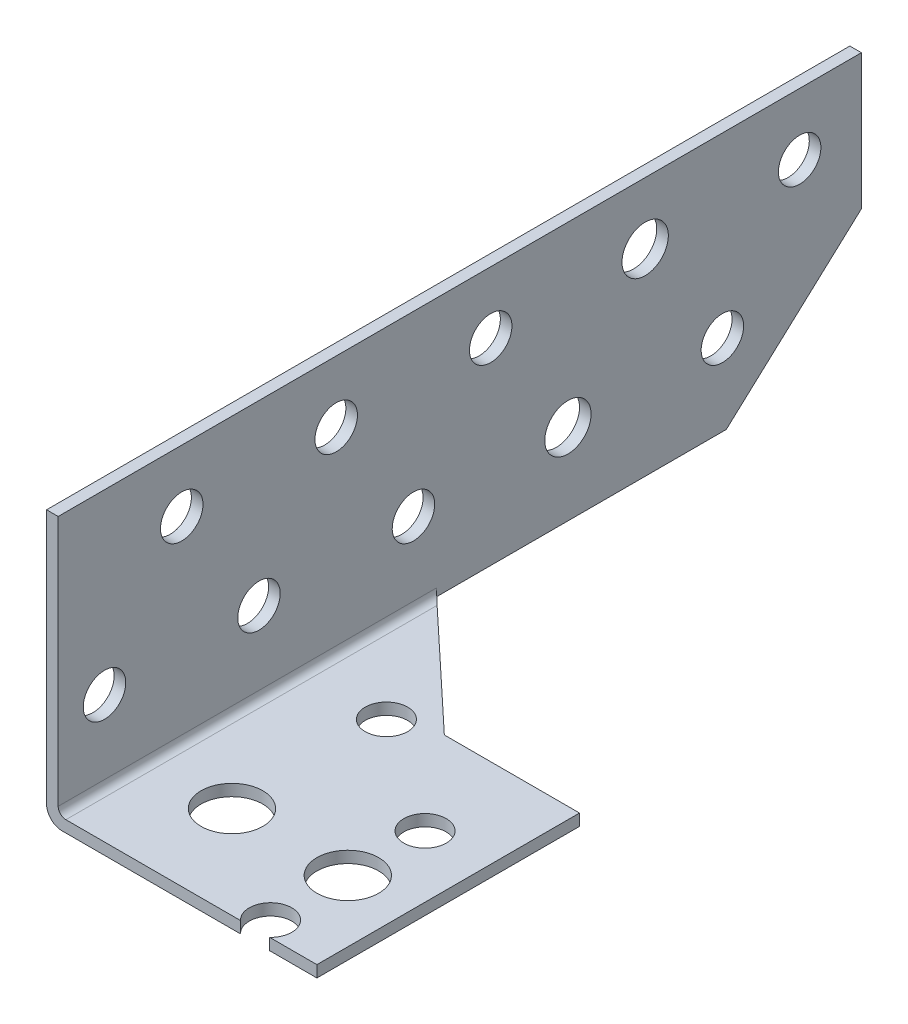
ISO-10303-21;
HEADER;
FILE_DESCRIPTION(('STEP AP214'),'2;1');
FILE_NAME('part.step','',(''),(''),'','','');
FILE_SCHEMA(('AUTOMOTIVE_DESIGN { 1 0 10303 214 1 1 1 1 }'));
ENDSEC;
DATA;
#1=APPLICATION_CONTEXT('core data for automotive mechanical design processes');
#2=APPLICATION_PROTOCOL_DEFINITION('international standard','automotive_design',2000,#1);
#3=PRODUCT_CONTEXT('',#1,'mechanical');
#4=PRODUCT('Part','Part','',(#3));
#5=PRODUCT_RELATED_PRODUCT_CATEGORY('part','',(#4));
#6=PRODUCT_DEFINITION_FORMATION('','',#4);
#7=PRODUCT_DEFINITION_CONTEXT('part definition',#1,'design');
#8=PRODUCT_DEFINITION('design','',#6,#7);
#9=PRODUCT_DEFINITION_SHAPE('','',#8);
#10=(LENGTH_UNIT() NAMED_UNIT(*) SI_UNIT(.MILLI.,.METRE.));
#11=(NAMED_UNIT(*) PLANE_ANGLE_UNIT() SI_UNIT($,.RADIAN.));
#12=(NAMED_UNIT(*) SI_UNIT($,.STERADIAN.) SOLID_ANGLE_UNIT());
#13=UNCERTAINTY_MEASURE_WITH_UNIT(LENGTH_MEASURE(1.E-05),#10,'distance_accuracy_value','');
#14=(GEOMETRIC_REPRESENTATION_CONTEXT(3) GLOBAL_UNCERTAINTY_ASSIGNED_CONTEXT((#13)) GLOBAL_UNIT_ASSIGNED_CONTEXT((#10,
#11,#12)) REPRESENTATION_CONTEXT('',''));
#15=CARTESIAN_POINT('',(0.,0.,0.));
#16=DIRECTION('',(0.,0.,1.));
#17=DIRECTION('',(1.,0.,0.));
#18=AXIS2_PLACEMENT_3D('',#15,#16,#17);
#19=CARTESIAN_POINT('',(-0.75,0.,210.));
#20=DIRECTION('',(1.,0.,0.));
#21=DIRECTION('',(0.,1.,0.));
#22=AXIS2_PLACEMENT_3D('',#19,#20,#21);
#23=PLANE('',#22);
#24=CARTESIAN_POINT('',(-0.750000000000001,9.5,28.));
#25=DIRECTION('',(1.,0.,0.));
#26=DIRECTION('',(0.,1.,0.));
#27=AXIS2_PLACEMENT_3D('',#24,#25,#26);
#28=CIRCLE('',#27,3.);
#29=CARTESIAN_POINT('',(-0.750000000000001,12.5,28.));
#30=VERTEX_POINT('',#29);
#31=EDGE_CURVE('E390',#30,#30,#28,.T.);
#32=ORIENTED_EDGE('',*,*,#31,.T.);
#33=EDGE_LOOP('',(#32));
#34=FACE_BOUND('',#33,.T.);
#35=CARTESIAN_POINT('',(-0.749999999999999,-5.5,38.));
#36=DIRECTION('',(1.,0.,0.));
#37=DIRECTION('',(0.,1.,0.));
#38=AXIS2_PLACEMENT_3D('',#35,#36,#37);
#39=CIRCLE('',#38,3.);
#40=CARTESIAN_POINT('',(-0.749999999999999,-2.5,38.));
#41=VERTEX_POINT('',#40);
#42=EDGE_CURVE('E394',#41,#41,#39,.T.);
#43=ORIENTED_EDGE('',*,*,#42,.T.);
#44=EDGE_LOOP('',(#43));
#45=FACE_BOUND('',#44,.T.);
#46=CARTESIAN_POINT('',(-0.749999999999999,-5.5,18.));
#47=DIRECTION('',(1.,0.,0.));
#48=DIRECTION('',(0.,1.,0.));
#49=AXIS2_PLACEMENT_3D('',#46,#47,#48);
#50=CIRCLE('',#49,2.75);
#51=CARTESIAN_POINT('',(-0.749999999999999,-2.75,18.));
#52=VERTEX_POINT('',#51);
#53=EDGE_CURVE('E296',#52,#52,#50,.T.);
#54=ORIENTED_EDGE('',*,*,#53,.T.);
#55=EDGE_LOOP('',(#54));
#56=FACE_BOUND('',#55,.T.);
#57=CARTESIAN_POINT('',(-0.750000000000001,9.49999999999999,88.));
#58=DIRECTION('',(1.,0.,0.));
#59=DIRECTION('',(0.,1.,0.));
#60=AXIS2_PLACEMENT_3D('',#57,#58,#59);
#61=CIRCLE('',#60,2.75000000000001);
#62=CARTESIAN_POINT('',(-0.750000000000002,12.25,88.));
#63=VERTEX_POINT('',#62);
#64=EDGE_CURVE('E292',#63,#63,#61,.T.);
#65=ORIENTED_EDGE('',*,*,#64,.T.);
#66=EDGE_LOOP('',(#65));
#67=FACE_BOUND('',#66,.T.);
#68=CARTESIAN_POINT('',(-0.750000000000001,9.49999999999999,68.));
#69=DIRECTION('',(1.,0.,0.));
#70=DIRECTION('',(0.,1.,0.));
#71=AXIS2_PLACEMENT_3D('',#68,#69,#70);
#72=CIRCLE('',#71,2.75000000000001);
#73=CARTESIAN_POINT('',(-0.750000000000002,12.25,68.));
#74=VERTEX_POINT('',#73);
#75=EDGE_CURVE('E288',#74,#74,#72,.T.);
#76=ORIENTED_EDGE('',*,*,#75,.T.);
#77=EDGE_LOOP('',(#76));
#78=FACE_BOUND('',#77,.T.);
#79=CARTESIAN_POINT('',(-0.750000000000001,9.5,48.));
#80=DIRECTION('',(1.,0.,0.));
#81=DIRECTION('',(0.,1.,0.));
#82=AXIS2_PLACEMENT_3D('',#79,#80,#81);
#83=CIRCLE('',#82,2.75);
#84=CARTESIAN_POINT('',(-0.750000000000002,12.25,48.));
#85=VERTEX_POINT('',#84);
#86=EDGE_CURVE('E284',#85,#85,#83,.T.);
#87=ORIENTED_EDGE('',*,*,#86,.T.);
#88=EDGE_LOOP('',(#87));
#89=FACE_BOUND('',#88,.T.);
#90=CARTESIAN_POINT('',(-0.749999999999999,-5.5,58.));
#91=DIRECTION('',(1.,0.,0.));
#92=DIRECTION('',(0.,1.,0.));
#93=AXIS2_PLACEMENT_3D('',#90,#91,#92);
#94=CIRCLE('',#93,2.75);
#95=CARTESIAN_POINT('',(-0.749999999999999,-2.75,58.));
#96=VERTEX_POINT('',#95);
#97=EDGE_CURVE('E280',#96,#96,#94,.T.);
#98=ORIENTED_EDGE('',*,*,#97,.T.);
#99=EDGE_LOOP('',(#98));
#100=FACE_BOUND('',#99,.T.);
#101=CARTESIAN_POINT('',(-0.749999999999999,-5.5,78.));
#102=DIRECTION('',(1.,0.,0.));
#103=DIRECTION('',(0.,1.,0.));
#104=AXIS2_PLACEMENT_3D('',#101,#102,#103);
#105=CIRCLE('',#104,2.75000000000001);
#106=CARTESIAN_POINT('',(-0.749999999999999,-2.74999999999999,78.));
#107=VERTEX_POINT('',#106);
#108=EDGE_CURVE('E276',#107,#107,#105,.T.);
#109=ORIENTED_EDGE('',*,*,#108,.T.);
#110=EDGE_LOOP('',(#109));
#111=FACE_BOUND('',#110,.T.);
#112=CARTESIAN_POINT('',(-0.749999999999999,-5.5,98.));
#113=DIRECTION('',(1.,0.,0.));
#114=DIRECTION('',(0.,1.,0.));
#115=AXIS2_PLACEMENT_3D('',#112,#113,#114);
#116=CIRCLE('',#115,2.75000000000001);
#117=CARTESIAN_POINT('',(-0.749999999999999,-2.74999999999999,98.));
#118=VERTEX_POINT('',#117);
#119=EDGE_CURVE('E272',#118,#118,#116,.T.);
#120=ORIENTED_EDGE('',*,*,#119,.T.);
#121=EDGE_LOOP('',(#120));
#122=FACE_BOUND('',#121,.T.);
#123=CARTESIAN_POINT('',(-0.750000000000001,9.5,8.00000000000001));
#124=DIRECTION('',(1.,0.,0.));
#125=DIRECTION('',(0.,1.,0.));
#126=AXIS2_PLACEMENT_3D('',#123,#124,#125);
#127=CIRCLE('',#126,2.75);
#128=CARTESIAN_POINT('',(-0.750000000000002,12.25,8.00000000000001));
#129=VERTEX_POINT('',#128);
#130=EDGE_CURVE('E268',#129,#129,#127,.T.);
#131=ORIENTED_EDGE('',*,*,#130,.T.);
#132=EDGE_LOOP('',(#131));
#133=FACE_BOUND('',#132,.T.);
#134=DIRECTION('',(0.,-1.,0.));
#135=VECTOR('',#134,1.);
#136=CARTESIAN_POINT('',(-0.75,0.,104.));
#137=LINE('',#136,#135);
#138=CARTESIAN_POINT('',(-0.750000000000002,17.5,104.));
#139=VERTEX_POINT('',#138);
#140=CARTESIAN_POINT('',(-0.749999999999997,-15.5,104.));
#141=VERTEX_POINT('',#140);
#142=EDGE_CURVE('E160',#139,#141,#137,.T.);
#143=ORIENTED_EDGE('',*,*,#142,.F.);
#144=DIRECTION('',(0.,0.,-1.));
#145=VECTOR('',#144,1.);
#146=CARTESIAN_POINT('',(-0.750000000000002,17.5,210.));
#147=LINE('',#146,#145);
#148=CARTESIAN_POINT('',(-0.750000000000002,17.5,0.));
#149=VERTEX_POINT('',#148);
#150=EDGE_CURVE('E49',#139,#149,#147,.T.);
#151=ORIENTED_EDGE('',*,*,#150,.T.);
#152=DIRECTION('',(0.,-1.,0.));
#153=VECTOR('',#152,1.);
#154=CARTESIAN_POINT('',(-0.75,0.,0.));
#155=LINE('',#154,#153);
#156=CARTESIAN_POINT('',(-0.75,0.,0.));
#157=VERTEX_POINT('',#156);
#158=EDGE_CURVE('E178',#149,#157,#155,.T.);
#159=ORIENTED_EDGE('',*,*,#158,.T.);
#160=DIRECTION('',(0.,0.674769199544936,-0.738028812002273));
#161=VECTOR('',#160,1.);
#162=CARTESIAN_POINT('',(-0.749999999999985,-104.579813250333,114.384170742552));
#163=LINE('',#162,#161);
#164=CARTESIAN_POINT('',(-0.749999999999998,-15.5,16.953125));
#165=VERTEX_POINT('',#164);
#166=EDGE_CURVE('E232',#165,#157,#163,.T.);
#167=ORIENTED_EDGE('',*,*,#166,.F.);
#168=DIRECTION('',(0.,0.,-1.));
#169=VECTOR('',#168,1.);
#170=CARTESIAN_POINT('',(-0.749999999999997,-15.5,210.));
#171=LINE('',#170,#169);
#172=EDGE_CURVE('E173',#165,#141,#171,.F.);
#173=ORIENTED_EDGE('',*,*,#172,.T.);
#174=EDGE_LOOP('',(#143,#151,#159,#167,#173));
#175=FACE_BOUND('',#174,.T.);
#176=ADVANCED_FACE('F46',(#34,#45,#56,#67,#78,#89,#100,#111,#122,#133,#175),#23,.F.);
#177=CARTESIAN_POINT('',(0.,-17.5,210.));
#178=DIRECTION('',(0.,1.,0.));
#179=DIRECTION('',(0.,0.,1.));
#180=AXIS2_PLACEMENT_3D('',#177,#178,#179);
#181=PLANE('',#180);
#182=CARTESIAN_POINT('',(11.25,-17.5,92.));
#183=DIRECTION('',(0.,1.,0.));
#184=DIRECTION('',(0.,0.,1.));
#185=AXIS2_PLACEMENT_3D('',#182,#183,#184);
#186=CIRCLE('',#185,4.);
#187=CARTESIAN_POINT('',(11.25,-17.5,96.));
#188=VERTEX_POINT('',#187);
#189=EDGE_CURVE('E300',#188,#188,#186,.T.);
#190=ORIENTED_EDGE('',*,*,#189,.T.);
#191=EDGE_LOOP('',(#190));
#192=FACE_BOUND('',#191,.T.);
#193=CARTESIAN_POINT('',(26.25,-17.5,92.));
#194=DIRECTION('',(0.,1.,0.));
#195=DIRECTION('',(0.,0.,1.));
#196=AXIS2_PLACEMENT_3D('',#193,#194,#195);
#197=CIRCLE('',#196,4.);
#198=CARTESIAN_POINT('',(26.25,-17.5,96.));
#199=VERTEX_POINT('',#198);
#200=EDGE_CURVE('E422',#199,#199,#197,.T.);
#201=ORIENTED_EDGE('',*,*,#200,.T.);
#202=EDGE_LOOP('',(#201));
#203=FACE_BOUND('',#202,.T.);
#204=CARTESIAN_POINT('',(26.25,-17.5,82.));
#205=DIRECTION('',(0.,1.,0.));
#206=DIRECTION('',(0.,0.,1.));
#207=AXIS2_PLACEMENT_3D('',#204,#205,#206);
#208=CIRCLE('',#207,2.75);
#209=CARTESIAN_POINT('',(26.25,-17.5,84.75));
#210=VERTEX_POINT('',#209);
#211=EDGE_CURVE('E177',#210,#210,#208,.T.);
#212=ORIENTED_EDGE('',*,*,#211,.T.);
#213=EDGE_LOOP('',(#212));
#214=FACE_BOUND('',#213,.T.);
#215=CARTESIAN_POINT('',(11.25,-17.5,72.));
#216=DIRECTION('',(0.,1.,0.));
#217=DIRECTION('',(0.,0.,1.));
#218=AXIS2_PLACEMENT_3D('',#215,#216,#217);
#219=CIRCLE('',#218,2.74999999999997);
#220=CARTESIAN_POINT('',(11.25,-17.5,74.75));
#221=VERTEX_POINT('',#220);
#222=EDGE_CURVE('E184',#221,#221,#219,.T.);
#223=ORIENTED_EDGE('',*,*,#222,.T.);
#224=EDGE_LOOP('',(#223));
#225=FACE_BOUND('',#224,.T.);
#226=DIRECTION('',(1.,0.,0.));
#227=VECTOR('',#226,1.);
#228=CARTESIAN_POINT('',(0.,-17.5,104.));
#229=LINE('',#228,#227);
#230=CARTESIAN_POINT('',(1.25,-17.5,104.));
#231=VERTEX_POINT('',#230);
#232=CARTESIAN_POINT('',(24.3625413911823,-17.5,104.));
#233=VERTEX_POINT('',#232);
#234=EDGE_CURVE('E162',#231,#233,#229,.T.);
#235=ORIENTED_EDGE('',*,*,#234,.F.);
#236=DIRECTION('',(0.,0.,-1.));
#237=VECTOR('',#236,1.);
#238=CARTESIAN_POINT('',(1.25,-17.5,210.));
#239=LINE('',#238,#237);
#240=CARTESIAN_POINT('',(1.25,-17.5,55.46875));
#241=VERTEX_POINT('',#240);
#242=EDGE_CURVE('E179',#231,#241,#239,.T.);
#243=ORIENTED_EDGE('',*,*,#242,.T.);
#244=DIRECTION('',(0.729537204140086,0.,0.683941128881329));
#245=VECTOR('',#244,1.);
#246=CARTESIAN_POINT('',(77.6897089397089,-17.5,127.130977130977));
#247=LINE('',#246,#245);
#248=CARTESIAN_POINT('',(16.75,-17.5,70.));
#249=VERTEX_POINT('',#248);
#250=EDGE_CURVE('E183',#241,#249,#247,.T.);
#251=ORIENTED_EDGE('',*,*,#250,.T.);
#252=DIRECTION('',(1.,0.,0.));
#253=VECTOR('',#252,1.);
#254=CARTESIAN_POINT('',(0.,-17.5,70.));
#255=LINE('',#254,#253);
#256=CARTESIAN_POINT('',(34.25,-17.5,70.));
#257=VERTEX_POINT('',#256);
#258=EDGE_CURVE('E252',#249,#257,#255,.T.);
#259=ORIENTED_EDGE('',*,*,#258,.T.);
#260=DIRECTION('',(0.,0.,-1.));
#261=VECTOR('',#260,1.);
#262=CARTESIAN_POINT('',(34.25,-17.5,210.));
#263=LINE('',#262,#261);
#264=CARTESIAN_POINT('',(34.25,-17.5,104.));
#265=VERTEX_POINT('',#264);
#266=EDGE_CURVE('E104',#265,#257,#263,.T.);
#267=ORIENTED_EDGE('',*,*,#266,.F.);
#268=CARTESIAN_POINT('',(28.1374586088177,-17.5,104.));
#269=VERTEX_POINT('',#268);
#270=EDGE_CURVE('E56',#269,#265,#229,.T.);
#271=ORIENTED_EDGE('',*,*,#270,.F.);
#272=CARTESIAN_POINT('',(26.25,-17.5,102.));
#273=DIRECTION('',(0.,1.,0.));
#274=DIRECTION('',(0.,0.,1.));
#275=AXIS2_PLACEMENT_3D('',#272,#273,#274);
#276=CIRCLE('',#275,2.75000000000001);
#277=EDGE_CURVE('E105',#269,#233,#276,.T.);
#278=ORIENTED_EDGE('',*,*,#277,.T.);
#279=EDGE_LOOP('',(#235,#243,#251,#259,#267,#271,#278));
#280=FACE_BOUND('',#279,.T.);
#281=ADVANCED_FACE('F377',(#192,#203,#214,#225,#280),#181,.F.);
#282=CARTESIAN_POINT('',(34.2500000000001,-1.58438077472549E-13,210.));
#283=DIRECTION('',(-1.,0.,0.));
#284=DIRECTION('',(0.,-1.,0.));
#285=AXIS2_PLACEMENT_3D('',#282,#283,#284);
#286=PLANE('',#285);
#287=DIRECTION('',(0.,-1.,0.));
#288=VECTOR('',#287,1.);
#289=CARTESIAN_POINT('',(34.25,33.,104.));
#290=LINE('',#289,#288);
#291=CARTESIAN_POINT('',(34.25,-16.,104.));
#292=VERTEX_POINT('',#291);
#293=EDGE_CURVE('E95',#292,#265,#290,.T.);
#294=ORIENTED_EDGE('',*,*,#293,.T.);
#295=ORIENTED_EDGE('',*,*,#266,.T.);
#296=DIRECTION('',(0.,1.,0.));
#297=VECTOR('',#296,1.);
#298=CARTESIAN_POINT('',(34.25,-78.,70.));
#299=LINE('',#298,#297);
#300=CARTESIAN_POINT('',(34.25,-16.,70.));
#301=VERTEX_POINT('',#300);
#302=EDGE_CURVE('E125',#257,#301,#299,.T.);
#303=ORIENTED_EDGE('',*,*,#302,.T.);
#304=DIRECTION('',(0.,0.,-1.));
#305=VECTOR('',#304,1.);
#306=CARTESIAN_POINT('',(34.25,-16.,210.));
#307=LINE('',#306,#305);
#308=EDGE_CURVE('E114',#292,#301,#307,.T.);
#309=ORIENTED_EDGE('',*,*,#308,.F.);
#310=EDGE_LOOP('',(#294,#295,#303,#309));
#311=FACE_BOUND('',#310,.T.);
#312=ADVANCED_FACE('F123',(#311),#286,.F.);
#313=CARTESIAN_POINT('',(0.,-16.,210.));
#314=DIRECTION('',(0.,1.,0.));
#315=DIRECTION('',(0.,0.,1.));
#316=AXIS2_PLACEMENT_3D('',#313,#314,#315);
#317=PLANE('',#316);
#318=CARTESIAN_POINT('',(11.25,-16.,92.));
#319=DIRECTION('',(0.,1.,0.));
#320=DIRECTION('',(0.,0.,1.));
#321=AXIS2_PLACEMENT_3D('',#318,#319,#320);
#322=CIRCLE('',#321,4.);
#323=CARTESIAN_POINT('',(11.25,-16.,96.));
#324=VERTEX_POINT('',#323);
#325=EDGE_CURVE('E426',#324,#324,#322,.T.);
#326=ORIENTED_EDGE('',*,*,#325,.F.);
#327=EDGE_LOOP('',(#326));
#328=FACE_BOUND('',#327,.T.);
#329=CARTESIAN_POINT('',(26.25,-16.,92.));
#330=DIRECTION('',(0.,1.,0.));
#331=DIRECTION('',(0.,0.,1.));
#332=AXIS2_PLACEMENT_3D('',#329,#330,#331);
#333=CIRCLE('',#332,4.);
#334=CARTESIAN_POINT('',(26.25,-16.,96.));
#335=VERTEX_POINT('',#334);
#336=EDGE_CURVE('E430',#335,#335,#333,.T.);
#337=ORIENTED_EDGE('',*,*,#336,.F.);
#338=EDGE_LOOP('',(#337));
#339=FACE_BOUND('',#338,.T.);
#340=CARTESIAN_POINT('',(11.25,-16.,72.));
#341=DIRECTION('',(0.,1.,0.));
#342=DIRECTION('',(0.,0.,1.));
#343=AXIS2_PLACEMENT_3D('',#340,#341,#342);
#344=CIRCLE('',#343,2.74999999999997);
#345=CARTESIAN_POINT('',(11.25,-16.,74.75));
#346=VERTEX_POINT('',#345);
#347=EDGE_CURVE('E158',#346,#346,#344,.T.);
#348=ORIENTED_EDGE('',*,*,#347,.F.);
#349=EDGE_LOOP('',(#348));
#350=FACE_BOUND('',#349,.T.);
#351=CARTESIAN_POINT('',(26.25,-16.,82.));
#352=DIRECTION('',(0.,1.,0.));
#353=DIRECTION('',(0.,0.,1.));
#354=AXIS2_PLACEMENT_3D('',#351,#352,#353);
#355=CIRCLE('',#354,2.75);
#356=CARTESIAN_POINT('',(26.25,-16.,84.75));
#357=VERTEX_POINT('',#356);
#358=EDGE_CURVE('E342',#357,#357,#355,.T.);
#359=ORIENTED_EDGE('',*,*,#358,.F.);
#360=EDGE_LOOP('',(#359));
#361=FACE_BOUND('',#360,.T.);
#362=DIRECTION('',(0.,0.,-1.));
#363=VECTOR('',#362,1.);
#364=CARTESIAN_POINT('',(1.75,-16.,153.));
#365=LINE('',#364,#363);
#366=CARTESIAN_POINT('',(1.75,-16.,55.9375));
#367=VERTEX_POINT('',#366);
#368=CARTESIAN_POINT('',(1.75,-16.,104.));
#369=VERTEX_POINT('',#368);
#370=EDGE_CURVE('E171',#367,#369,#365,.F.);
#371=ORIENTED_EDGE('',*,*,#370,.T.);
#372=DIRECTION('',(1.,0.,0.));
#373=VECTOR('',#372,1.);
#374=CARTESIAN_POINT('',(0.,-16.,104.));
#375=LINE('',#374,#373);
#376=CARTESIAN_POINT('',(24.3625413911823,-16.,104.));
#377=VERTEX_POINT('',#376);
#378=EDGE_CURVE('E120',#369,#377,#375,.T.);
#379=ORIENTED_EDGE('',*,*,#378,.T.);
#380=CARTESIAN_POINT('',(26.25,-16.,102.));
#381=DIRECTION('',(0.,1.,0.));
#382=DIRECTION('',(0.,0.,1.));
#383=AXIS2_PLACEMENT_3D('',#380,#381,#382);
#384=CIRCLE('',#383,2.75000000000001);
#385=CARTESIAN_POINT('',(28.1374586088177,-16.,104.));
#386=VERTEX_POINT('',#385);
#387=EDGE_CURVE('E118',#386,#377,#384,.T.);
#388=ORIENTED_EDGE('',*,*,#387,.F.);
#389=EDGE_CURVE('E98',#386,#292,#375,.T.);
#390=ORIENTED_EDGE('',*,*,#389,.T.);
#391=ORIENTED_EDGE('',*,*,#308,.T.);
#392=DIRECTION('',(1.,0.,0.));
#393=VECTOR('',#392,1.);
#394=CARTESIAN_POINT('',(34.25,-16.,70.));
#395=LINE('',#394,#393);
#396=CARTESIAN_POINT('',(16.75,-16.,70.));
#397=VERTEX_POINT('',#396);
#398=EDGE_CURVE('E259',#397,#301,#395,.T.);
#399=ORIENTED_EDGE('',*,*,#398,.F.);
#400=DIRECTION('',(0.729537204140086,0.,0.683941128881329));
#401=VECTOR('',#400,1.);
#402=CARTESIAN_POINT('',(16.75,-16.,70.));
#403=LINE('',#402,#401);
#404=EDGE_CURVE('E218',#367,#397,#403,.T.);
#405=ORIENTED_EDGE('',*,*,#404,.F.);
#406=EDGE_LOOP('',(#371,#379,#388,#390,#391,#399,#405));
#407=FACE_BOUND('',#406,.T.);
#408=ADVANCED_FACE('F111',(#328,#339,#350,#361,#407),#317,.T.);
#409=CARTESIAN_POINT('',(0.75,0.,210.));
#410=DIRECTION('',(1.,0.,0.));
#411=DIRECTION('',(0.,1.,0.));
#412=AXIS2_PLACEMENT_3D('',#409,#410,#411);
#413=PLANE('',#412);
#414=CARTESIAN_POINT('',(0.749999999999999,9.5,28.));
#415=DIRECTION('',(1.,0.,0.));
#416=DIRECTION('',(0.,1.,0.));
#417=AXIS2_PLACEMENT_3D('',#414,#415,#416);
#418=CIRCLE('',#417,3.);
#419=CARTESIAN_POINT('',(0.749999999999999,12.5,28.));
#420=VERTEX_POINT('',#419);
#421=EDGE_CURVE('E438',#420,#420,#418,.T.);
#422=ORIENTED_EDGE('',*,*,#421,.F.);
#423=EDGE_LOOP('',(#422));
#424=FACE_BOUND('',#423,.T.);
#425=CARTESIAN_POINT('',(0.750000000000001,-5.5,38.));
#426=DIRECTION('',(1.,0.,0.));
#427=DIRECTION('',(0.,1.,0.));
#428=AXIS2_PLACEMENT_3D('',#425,#426,#427);
#429=CIRCLE('',#428,3.);
#430=CARTESIAN_POINT('',(0.75,-2.5,38.));
#431=VERTEX_POINT('',#430);
#432=EDGE_CURVE('E442',#431,#431,#429,.T.);
#433=ORIENTED_EDGE('',*,*,#432,.F.);
#434=EDGE_LOOP('',(#433));
#435=FACE_BOUND('',#434,.T.);
#436=CARTESIAN_POINT('',(0.749999999999999,9.5,8.00000000000001));
#437=DIRECTION('',(1.,0.,0.));
#438=DIRECTION('',(0.,1.,0.));
#439=AXIS2_PLACEMENT_3D('',#436,#437,#438);
#440=CIRCLE('',#439,2.75);
#441=CARTESIAN_POINT('',(0.749999999999999,12.25,8.00000000000001));
#442=VERTEX_POINT('',#441);
#443=EDGE_CURVE('E321',#442,#442,#440,.T.);
#444=ORIENTED_EDGE('',*,*,#443,.F.);
#445=EDGE_LOOP('',(#444));
#446=FACE_BOUND('',#445,.T.);
#447=CARTESIAN_POINT('',(0.750000000000001,-5.5,98.));
#448=DIRECTION('',(1.,0.,0.));
#449=DIRECTION('',(0.,1.,0.));
#450=AXIS2_PLACEMENT_3D('',#447,#448,#449);
#451=CIRCLE('',#450,2.75000000000001);
#452=CARTESIAN_POINT('',(0.75,-2.74999999999999,98.));
#453=VERTEX_POINT('',#452);
#454=EDGE_CURVE('E317',#453,#453,#451,.T.);
#455=ORIENTED_EDGE('',*,*,#454,.F.);
#456=EDGE_LOOP('',(#455));
#457=FACE_BOUND('',#456,.T.);
#458=CARTESIAN_POINT('',(0.750000000000001,-5.5,78.));
#459=DIRECTION('',(1.,0.,0.));
#460=DIRECTION('',(0.,1.,0.));
#461=AXIS2_PLACEMENT_3D('',#458,#459,#460);
#462=CIRCLE('',#461,2.75000000000001);
#463=CARTESIAN_POINT('',(0.75,-2.74999999999999,78.));
#464=VERTEX_POINT('',#463);
#465=EDGE_CURVE('E322',#464,#464,#462,.T.);
#466=ORIENTED_EDGE('',*,*,#465,.F.);
#467=EDGE_LOOP('',(#466));
#468=FACE_BOUND('',#467,.T.);
#469=CARTESIAN_POINT('',(0.750000000000001,-5.5,58.));
#470=DIRECTION('',(1.,0.,0.));
#471=DIRECTION('',(0.,1.,0.));
#472=AXIS2_PLACEMENT_3D('',#469,#470,#471);
#473=CIRCLE('',#472,2.75);
#474=CARTESIAN_POINT('',(0.75,-2.75,58.));
#475=VERTEX_POINT('',#474);
#476=EDGE_CURVE('E313',#475,#475,#473,.T.);
#477=ORIENTED_EDGE('',*,*,#476,.F.);
#478=EDGE_LOOP('',(#477));
#479=FACE_BOUND('',#478,.T.);
#480=CARTESIAN_POINT('',(0.749999999999999,9.5,48.));
#481=DIRECTION('',(1.,0.,0.));
#482=DIRECTION('',(0.,1.,0.));
#483=AXIS2_PLACEMENT_3D('',#480,#481,#482);
#484=CIRCLE('',#483,2.75);
#485=CARTESIAN_POINT('',(0.749999999999999,12.25,48.));
#486=VERTEX_POINT('',#485);
#487=EDGE_CURVE('E309',#486,#486,#484,.T.);
#488=ORIENTED_EDGE('',*,*,#487,.F.);
#489=EDGE_LOOP('',(#488));
#490=FACE_BOUND('',#489,.T.);
#491=CARTESIAN_POINT('',(0.749999999999999,9.49999999999999,68.));
#492=DIRECTION('',(1.,0.,0.));
#493=DIRECTION('',(0.,1.,0.));
#494=AXIS2_PLACEMENT_3D('',#491,#492,#493);
#495=CIRCLE('',#494,2.75000000000001);
#496=CARTESIAN_POINT('',(0.749999999999999,12.25,68.));
#497=VERTEX_POINT('',#496);
#498=EDGE_CURVE('E305',#497,#497,#495,.T.);
#499=ORIENTED_EDGE('',*,*,#498,.F.);
#500=EDGE_LOOP('',(#499));
#501=FACE_BOUND('',#500,.T.);
#502=CARTESIAN_POINT('',(0.749999999999999,9.49999999999999,88.));
#503=DIRECTION('',(1.,0.,0.));
#504=DIRECTION('',(0.,1.,0.));
#505=AXIS2_PLACEMENT_3D('',#502,#503,#504);
#506=CIRCLE('',#505,2.75000000000001);
#507=CARTESIAN_POINT('',(0.749999999999999,12.25,88.));
#508=VERTEX_POINT('',#507);
#509=EDGE_CURVE('E301',#508,#508,#506,.T.);
#510=ORIENTED_EDGE('',*,*,#509,.F.);
#511=EDGE_LOOP('',(#510));
#512=FACE_BOUND('',#511,.T.);
#513=CARTESIAN_POINT('',(0.750000000000001,-5.5,18.));
#514=DIRECTION('',(1.,0.,0.));
#515=DIRECTION('',(0.,1.,0.));
#516=AXIS2_PLACEMENT_3D('',#513,#514,#515);
#517=CIRCLE('',#516,2.75);
#518=CARTESIAN_POINT('',(0.75,-2.75,18.));
#519=VERTEX_POINT('',#518);
#520=EDGE_CURVE('E221',#519,#519,#517,.T.);
#521=ORIENTED_EDGE('',*,*,#520,.F.);
#522=EDGE_LOOP('',(#521));
#523=FACE_BOUND('',#522,.T.);
#524=DIRECTION('',(0.,0.,-1.));
#525=VECTOR('',#524,1.);
#526=CARTESIAN_POINT('',(0.749999999999998,17.5,210.));
#527=LINE('',#526,#525);
#528=CARTESIAN_POINT('',(0.749999999999998,17.5,104.));
#529=VERTEX_POINT('',#528);
#530=CARTESIAN_POINT('',(0.749999999999998,17.5,0.));
#531=VERTEX_POINT('',#530);
#532=EDGE_CURVE('E135',#529,#531,#527,.T.);
#533=ORIENTED_EDGE('',*,*,#532,.F.);
#534=DIRECTION('',(0.,-1.,0.));
#535=VECTOR('',#534,1.);
#536=CARTESIAN_POINT('',(0.75,0.,104.));
#537=LINE('',#536,#535);
#538=CARTESIAN_POINT('',(0.750000000000002,-15.,104.));
#539=VERTEX_POINT('',#538);
#540=EDGE_CURVE('E127',#529,#539,#537,.T.);
#541=ORIENTED_EDGE('',*,*,#540,.T.);
#542=DIRECTION('',(0.,0.,-1.));
#543=VECTOR('',#542,1.);
#544=CARTESIAN_POINT('',(0.750000000000002,-15.,55.));
#545=LINE('',#544,#543);
#546=CARTESIAN_POINT('',(0.750000000000001,-15.,55.));
#547=VERTEX_POINT('',#546);
#548=EDGE_CURVE('E131',#539,#547,#545,.T.);
#549=ORIENTED_EDGE('',*,*,#548,.T.);
#550=DIRECTION('',(0.,1.,0.));
#551=VECTOR('',#550,1.);
#552=CARTESIAN_POINT('',(0.750000000000001,-78.,55.));
#553=LINE('',#552,#551);
#554=CARTESIAN_POINT('',(0.750000000000002,-16.,55.));
#555=VERTEX_POINT('',#554);
#556=EDGE_CURVE('E196',#555,#547,#553,.T.);
#557=ORIENTED_EDGE('',*,*,#556,.F.);
#558=DIRECTION('',(0.,0.,1.));
#559=VECTOR('',#558,1.);
#560=CARTESIAN_POINT('',(0.750000000000002,-16.,55.));
#561=LINE('',#560,#559);
#562=CARTESIAN_POINT('',(0.750000000000002,-16.,17.5));
#563=VERTEX_POINT('',#562);
#564=EDGE_CURVE('E338',#563,#555,#561,.T.);
#565=ORIENTED_EDGE('',*,*,#564,.F.);
#566=DIRECTION('',(0.,0.674769199544936,-0.738028812002273));
#567=VECTOR('',#566,1.);
#568=CARTESIAN_POINT('',(0.750000000000013,-104.579813250333,114.384170742552));
#569=LINE('',#568,#567);
#570=CARTESIAN_POINT('',(0.750000000000001,0.,0.));
#571=VERTEX_POINT('',#570);
#572=EDGE_CURVE('E150',#563,#571,#569,.T.);
#573=ORIENTED_EDGE('',*,*,#572,.T.);
#574=DIRECTION('',(0.,-1.,0.));
#575=VECTOR('',#574,1.);
#576=CARTESIAN_POINT('',(0.75,0.,0.));
#577=LINE('',#576,#575);
#578=EDGE_CURVE('E237',#531,#571,#577,.T.);
#579=ORIENTED_EDGE('',*,*,#578,.F.);
#580=EDGE_LOOP('',(#533,#541,#549,#557,#565,#573,#579));
#581=FACE_BOUND('',#580,.T.);
#582=ADVANCED_FACE('F193',(#424,#435,#446,#457,#468,#479,#490,#501,#512,#523,#581),#413,.T.);
#583=CARTESIAN_POINT('',(0.,17.5,210.));
#584=DIRECTION('',(0.,1.,0.));
#585=DIRECTION('',(0.,0.,1.));
#586=AXIS2_PLACEMENT_3D('',#583,#584,#585);
#587=PLANE('',#586);
#588=ORIENTED_EDGE('',*,*,#150,.F.);
#589=DIRECTION('',(1.,0.,0.));
#590=VECTOR('',#589,1.);
#591=CARTESIAN_POINT('',(0.,17.5,104.));
#592=LINE('',#591,#590);
#593=EDGE_CURVE('E139',#139,#529,#592,.T.);
#594=ORIENTED_EDGE('',*,*,#593,.T.);
#595=ORIENTED_EDGE('',*,*,#532,.T.);
#596=DIRECTION('',(1.,0.,0.));
#597=VECTOR('',#596,1.);
#598=CARTESIAN_POINT('',(0.,17.5,0.));
#599=LINE('',#598,#597);
#600=EDGE_CURVE('E233',#149,#531,#599,.T.);
#601=ORIENTED_EDGE('',*,*,#600,.F.);
#602=EDGE_LOOP('',(#588,#594,#595,#601));
#603=FACE_BOUND('',#602,.T.);
#604=ADVANCED_FACE('F373',(#603),#587,.T.);
#605=CARTESIAN_POINT('',(1.75,-15.,210.));
#606=DIRECTION('',(0.,0.,1.));
#607=DIRECTION('',(1.,0.,0.));
#608=AXIS2_PLACEMENT_3D('',#605,#606,#607);
#609=CYLINDRICAL_SURFACE('',#608,1.);
#610=CARTESIAN_POINT('',(1.75,-15.,104.));
#611=DIRECTION('',(0.,0.,1.));
#612=DIRECTION('',(1.,0.,0.));
#613=AXIS2_PLACEMENT_3D('',#610,#611,#612);
#614=CIRCLE('',#613,1.);
#615=EDGE_CURVE('E164',#369,#539,#614,.F.);
#616=ORIENTED_EDGE('',*,*,#615,.F.);
#617=ORIENTED_EDGE('',*,*,#370,.F.);
#618=CARTESIAN_POINT('',(1.75,-15.,55.9375));
#619=DIRECTION('',(-0.683941128881329,0.,0.729537204140086));
#620=DIRECTION('',(0.729537204140086,0.,0.683941128881329));
#621=AXIS2_PLACEMENT_3D('',#618,#619,#620);
#622=ELLIPSE('',#621,1.37073201246633,1.);
#623=EDGE_CURVE('E208',#547,#367,#622,.T.);
#624=ORIENTED_EDGE('',*,*,#623,.F.);
#625=ORIENTED_EDGE('',*,*,#548,.F.);
#626=EDGE_LOOP('',(#616,#617,#624,#625));
#627=FACE_BOUND('',#626,.T.);
#628=ADVANCED_FACE('F216',(#627),#609,.F.);
#629=CARTESIAN_POINT('',(1.25,-15.5,210.));
#630=DIRECTION('',(0.,0.,-1.));
#631=DIRECTION('',(-1.,0.,0.));
#632=AXIS2_PLACEMENT_3D('',#629,#630,#631);
#633=CYLINDRICAL_SURFACE('',#632,2.);
#634=ORIENTED_EDGE('',*,*,#242,.F.);
#635=CARTESIAN_POINT('',(1.25,-15.5,104.));
#636=DIRECTION('',(0.,0.,1.));
#637=DIRECTION('',(1.,0.,0.));
#638=AXIS2_PLACEMENT_3D('',#635,#636,#637);
#639=CIRCLE('',#638,2.);
#640=EDGE_CURVE('E138',#231,#141,#639,.F.);
#641=ORIENTED_EDGE('',*,*,#640,.T.);
#642=ORIENTED_EDGE('',*,*,#172,.F.);
#643=CARTESIAN_POINT('',(1.25,-15.5,16.953125));
#644=DIRECTION('',(0.,-0.738028812002273,-0.674769199544936));
#645=DIRECTION('',(0.,0.674769199544936,-0.738028812002273));
#646=AXIS2_PLACEMENT_3D('',#643,#644,#645);
#647=ELLIPSE('',#646,2.96397642534484,2.);
#648=CARTESIAN_POINT('',(-0.686491673103705,-16.,17.5));
#649=VERTEX_POINT('',#648);
#650=EDGE_CURVE('E247',#649,#165,#647,.T.);
#651=ORIENTED_EDGE('',*,*,#650,.F.);
#652=DIRECTION('',(0.,0.,-1.));
#653=VECTOR('',#652,1.);
#654=CARTESIAN_POINT('',(-0.686491673103705,-16.,210.));
#655=LINE('',#654,#653);
#656=CARTESIAN_POINT('',(-0.686491673103705,-16.,55.));
#657=VERTEX_POINT('',#656);
#658=EDGE_CURVE('E337',#657,#649,#655,.T.);
#659=ORIENTED_EDGE('',*,*,#658,.F.);
#660=CARTESIAN_POINT('',(1.25,-15.5,55.));
#661=DIRECTION('',(0.,0.,1.));
#662=DIRECTION('',(1.,0.,0.));
#663=AXIS2_PLACEMENT_3D('',#660,#661,#662);
#664=CIRCLE('',#663,2.);
#665=CARTESIAN_POINT('',(0.750000000000002,-17.4364916731037,55.));
#666=VERTEX_POINT('',#665);
#667=EDGE_CURVE('E332',#666,#657,#664,.F.);
#668=ORIENTED_EDGE('',*,*,#667,.F.);
#669=CARTESIAN_POINT('',(1.25,-15.5,55.46875));
#670=DIRECTION('',(-0.683941128881329,0.,0.729537204140086));
#671=DIRECTION('',(-0.729537204140086,0.,-0.683941128881329));
#672=AXIS2_PLACEMENT_3D('',#669,#670,#671);
#673=ELLIPSE('',#672,2.74146402493266,2.);
#674=EDGE_CURVE('E225',#241,#666,#673,.F.);
#675=ORIENTED_EDGE('',*,*,#674,.F.);
#676=EDGE_LOOP('',(#634,#641,#642,#651,#659,#668,#675));
#677=FACE_BOUND('',#676,.T.);
#678=ADVANCED_FACE('F471',(#677),#633,.T.);
#679=CARTESIAN_POINT('',(26.25,-21.,102.));
#680=DIRECTION('',(0.,1.,0.));
#681=DIRECTION('',(0.,0.,1.));
#682=AXIS2_PLACEMENT_3D('',#679,#680,#681);
#683=CYLINDRICAL_SURFACE('',#682,2.75000000000001);
#684=DIRECTION('',(0.,1.,0.));
#685=VECTOR('',#684,1.);
#686=CARTESIAN_POINT('',(28.1374586088177,-21.,104.));
#687=LINE('',#686,#685);
#688=EDGE_CURVE('E11',#386,#269,#687,.F.);
#689=ORIENTED_EDGE('',*,*,#688,.F.);
#690=ORIENTED_EDGE('',*,*,#387,.T.);
#691=DIRECTION('',(0.,1.,0.));
#692=VECTOR('',#691,1.);
#693=CARTESIAN_POINT('',(24.3625413911823,-21.,104.));
#694=LINE('',#693,#692);
#695=EDGE_CURVE('E166',#233,#377,#694,.T.);
#696=ORIENTED_EDGE('',*,*,#695,.F.);
#697=ORIENTED_EDGE('',*,*,#277,.F.);
#698=EDGE_LOOP('',(#689,#690,#696,#697));
#699=FACE_BOUND('',#698,.T.);
#700=ADVANCED_FACE('F481',(#699),#683,.F.);
#701=CARTESIAN_POINT('',(0.,0.,0.));
#702=DIRECTION('',(0.,0.,1.));
#703=DIRECTION('',(1.,0.,0.));
#704=AXIS2_PLACEMENT_3D('',#701,#702,#703);
#705=PLANE('',#704);
#706=DIRECTION('',(1.,0.,0.));
#707=VECTOR('',#706,1.);
#708=CARTESIAN_POINT('',(0.,0.,0.));
#709=LINE('',#708,#707);
#710=EDGE_CURVE('E227',#157,#571,#709,.T.);
#711=ORIENTED_EDGE('',*,*,#710,.F.);
#712=ORIENTED_EDGE('',*,*,#158,.F.);
#713=ORIENTED_EDGE('',*,*,#600,.T.);
#714=ORIENTED_EDGE('',*,*,#578,.T.);
#715=EDGE_LOOP('',(#711,#712,#713,#714));
#716=FACE_BOUND('',#715,.T.);
#717=ADVANCED_FACE('F507',(#716),#705,.F.);
#718=CARTESIAN_POINT('',(62.75,0.,0.));
#719=DIRECTION('',(0.,-0.738028812002273,-0.674769199544936));
#720=DIRECTION('',(0.,0.674769199544936,-0.738028812002273));
#721=AXIS2_PLACEMENT_3D('',#718,#719,#720);
#722=PLANE('',#721);
#723=DIRECTION('',(-1.,0.,0.));
#724=VECTOR('',#723,1.);
#725=CARTESIAN_POINT('',(62.75,-16.,17.5));
#726=LINE('',#725,#724);
#727=EDGE_CURVE('E241',#563,#649,#726,.T.);
#728=ORIENTED_EDGE('',*,*,#727,.T.);
#729=ORIENTED_EDGE('',*,*,#650,.T.);
#730=ORIENTED_EDGE('',*,*,#166,.T.);
#731=ORIENTED_EDGE('',*,*,#710,.T.);
#732=ORIENTED_EDGE('',*,*,#572,.F.);
#733=EDGE_LOOP('',(#728,#729,#730,#731,#732));
#734=FACE_BOUND('',#733,.T.);
#735=ADVANCED_FACE('F461',(#734),#722,.T.);
#736=CARTESIAN_POINT('',(34.25,-78.,70.));
#737=DIRECTION('',(0.,0.,1.));
#738=DIRECTION('',(1.,0.,0.));
#739=AXIS2_PLACEMENT_3D('',#736,#737,#738);
#740=PLANE('',#739);
#741=DIRECTION('',(0.,1.,0.));
#742=VECTOR('',#741,1.);
#743=CARTESIAN_POINT('',(16.75,-78.,70.));
#744=LINE('',#743,#742);
#745=EDGE_CURVE('E231',#249,#397,#744,.T.);
#746=ORIENTED_EDGE('',*,*,#745,.T.);
#747=ORIENTED_EDGE('',*,*,#398,.T.);
#748=ORIENTED_EDGE('',*,*,#302,.F.);
#749=ORIENTED_EDGE('',*,*,#258,.F.);
#750=EDGE_LOOP('',(#746,#747,#748,#749));
#751=FACE_BOUND('',#750,.T.);
#752=ADVANCED_FACE('F490',(#751),#740,.F.);
#753=CARTESIAN_POINT('',(16.75,-78.,70.));
#754=DIRECTION('',(-0.683941128881329,0.,0.729537204140086));
#755=DIRECTION('',(0.729537204140086,0.,0.683941128881329));
#756=AXIS2_PLACEMENT_3D('',#753,#754,#755);
#757=PLANE('',#756);
#758=ORIENTED_EDGE('',*,*,#250,.F.);
#759=ORIENTED_EDGE('',*,*,#674,.T.);
#760=EDGE_CURVE('E212',#666,#555,#553,.T.);
#761=ORIENTED_EDGE('',*,*,#760,.T.);
#762=ORIENTED_EDGE('',*,*,#556,.T.);
#763=ORIENTED_EDGE('',*,*,#623,.T.);
#764=ORIENTED_EDGE('',*,*,#404,.T.);
#765=ORIENTED_EDGE('',*,*,#745,.F.);
#766=EDGE_LOOP('',(#758,#759,#761,#762,#763,#764,#765));
#767=FACE_BOUND('',#766,.T.);
#768=ADVANCED_FACE('F205',(#767),#757,.F.);
#769=CARTESIAN_POINT('',(-4.25,-5.5,18.));
#770=DIRECTION('',(1.,0.,0.));
#771=DIRECTION('',(0.,1.,0.));
#772=AXIS2_PLACEMENT_3D('',#769,#770,#771);
#773=CYLINDRICAL_SURFACE('',#772,2.75);
#774=ORIENTED_EDGE('',*,*,#520,.T.);
#775=EDGE_LOOP('',(#774));
#776=FACE_BOUND('',#775,.T.);
#777=ORIENTED_EDGE('',*,*,#53,.F.);
#778=EDGE_LOOP('',(#777));
#779=FACE_BOUND('',#778,.T.);
#780=ADVANCED_FACE('F525',(#776,#779),#773,.F.);
#781=CARTESIAN_POINT('',(-4.25,9.49999999999999,88.));
#782=DIRECTION('',(1.,0.,0.));
#783=DIRECTION('',(0.,1.,0.));
#784=AXIS2_PLACEMENT_3D('',#781,#782,#783);
#785=CYLINDRICAL_SURFACE('',#784,2.75000000000001);
#786=ORIENTED_EDGE('',*,*,#509,.T.);
#787=EDGE_LOOP('',(#786));
#788=FACE_BOUND('',#787,.T.);
#789=ORIENTED_EDGE('',*,*,#64,.F.);
#790=EDGE_LOOP('',(#789));
#791=FACE_BOUND('',#790,.T.);
#792=ADVANCED_FACE('F526',(#788,#791),#785,.F.);
#793=CARTESIAN_POINT('',(-4.25,9.49999999999999,68.));
#794=DIRECTION('',(1.,0.,0.));
#795=DIRECTION('',(0.,1.,0.));
#796=AXIS2_PLACEMENT_3D('',#793,#794,#795);
#797=CYLINDRICAL_SURFACE('',#796,2.75000000000001);
#798=ORIENTED_EDGE('',*,*,#498,.T.);
#799=EDGE_LOOP('',(#798));
#800=FACE_BOUND('',#799,.T.);
#801=ORIENTED_EDGE('',*,*,#75,.F.);
#802=EDGE_LOOP('',(#801));
#803=FACE_BOUND('',#802,.T.);
#804=ADVANCED_FACE('F529',(#800,#803),#797,.F.);
#805=CARTESIAN_POINT('',(-4.25,9.5,48.));
#806=DIRECTION('',(1.,0.,0.));
#807=DIRECTION('',(0.,1.,0.));
#808=AXIS2_PLACEMENT_3D('',#805,#806,#807);
#809=CYLINDRICAL_SURFACE('',#808,2.75);
#810=ORIENTED_EDGE('',*,*,#487,.T.);
#811=EDGE_LOOP('',(#810));
#812=FACE_BOUND('',#811,.T.);
#813=ORIENTED_EDGE('',*,*,#86,.F.);
#814=EDGE_LOOP('',(#813));
#815=FACE_BOUND('',#814,.T.);
#816=ADVANCED_FACE('F533',(#812,#815),#809,.F.);
#817=CARTESIAN_POINT('',(-4.25,-5.5,58.));
#818=DIRECTION('',(1.,0.,0.));
#819=DIRECTION('',(0.,1.,0.));
#820=AXIS2_PLACEMENT_3D('',#817,#818,#819);
#821=CYLINDRICAL_SURFACE('',#820,2.75);
#822=ORIENTED_EDGE('',*,*,#476,.T.);
#823=EDGE_LOOP('',(#822));
#824=FACE_BOUND('',#823,.T.);
#825=ORIENTED_EDGE('',*,*,#97,.F.);
#826=EDGE_LOOP('',(#825));
#827=FACE_BOUND('',#826,.T.);
#828=ADVANCED_FACE('F537',(#824,#827),#821,.F.);
#829=CARTESIAN_POINT('',(-4.25,-5.5,78.));
#830=DIRECTION('',(1.,0.,0.));
#831=DIRECTION('',(0.,1.,0.));
#832=AXIS2_PLACEMENT_3D('',#829,#830,#831);
#833=CYLINDRICAL_SURFACE('',#832,2.75000000000001);
#834=ORIENTED_EDGE('',*,*,#465,.T.);
#835=EDGE_LOOP('',(#834));
#836=FACE_BOUND('',#835,.T.);
#837=ORIENTED_EDGE('',*,*,#108,.F.);
#838=EDGE_LOOP('',(#837));
#839=FACE_BOUND('',#838,.T.);
#840=ADVANCED_FACE('F546',(#836,#839),#833,.F.);
#841=CARTESIAN_POINT('',(-4.25,-5.5,98.));
#842=DIRECTION('',(1.,0.,0.));
#843=DIRECTION('',(0.,1.,0.));
#844=AXIS2_PLACEMENT_3D('',#841,#842,#843);
#845=CYLINDRICAL_SURFACE('',#844,2.75000000000001);
#846=ORIENTED_EDGE('',*,*,#454,.T.);
#847=EDGE_LOOP('',(#846));
#848=FACE_BOUND('',#847,.T.);
#849=ORIENTED_EDGE('',*,*,#119,.F.);
#850=EDGE_LOOP('',(#849));
#851=FACE_BOUND('',#850,.T.);
#852=ADVANCED_FACE('F542',(#848,#851),#845,.F.);
#853=CARTESIAN_POINT('',(-4.25,9.5,8.00000000000001));
#854=DIRECTION('',(1.,0.,0.));
#855=DIRECTION('',(0.,1.,0.));
#856=AXIS2_PLACEMENT_3D('',#853,#854,#855);
#857=CYLINDRICAL_SURFACE('',#856,2.75);
#858=ORIENTED_EDGE('',*,*,#443,.T.);
#859=EDGE_LOOP('',(#858));
#860=FACE_BOUND('',#859,.T.);
#861=ORIENTED_EDGE('',*,*,#130,.F.);
#862=EDGE_LOOP('',(#861));
#863=FACE_BOUND('',#862,.T.);
#864=ADVANCED_FACE('F545',(#860,#863),#857,.F.);
#865=CARTESIAN_POINT('',(-4.25,-17.4364916731037,55.));
#866=DIRECTION('',(0.,0.,1.));
#867=DIRECTION('',(1.,0.,0.));
#868=AXIS2_PLACEMENT_3D('',#865,#866,#867);
#869=PLANE('',#868);
#870=ORIENTED_EDGE('',*,*,#667,.T.);
#871=DIRECTION('',(1.,0.,0.));
#872=VECTOR('',#871,1.);
#873=CARTESIAN_POINT('',(-4.25,-16.,55.));
#874=LINE('',#873,#872);
#875=EDGE_CURVE('E333',#657,#555,#874,.T.);
#876=ORIENTED_EDGE('',*,*,#875,.T.);
#877=ORIENTED_EDGE('',*,*,#760,.F.);
#878=EDGE_LOOP('',(#870,#876,#877));
#879=FACE_BOUND('',#878,.T.);
#880=ADVANCED_FACE('F556',(#879),#869,.F.);
#881=CARTESIAN_POINT('',(-4.25,-16.,55.));
#882=DIRECTION('',(0.,1.,0.));
#883=DIRECTION('',(-1.,0.,0.));
#884=AXIS2_PLACEMENT_3D('',#881,#882,#883);
#885=PLANE('',#884);
#886=ORIENTED_EDGE('',*,*,#658,.T.);
#887=ORIENTED_EDGE('',*,*,#727,.F.);
#888=ORIENTED_EDGE('',*,*,#564,.T.);
#889=ORIENTED_EDGE('',*,*,#875,.F.);
#890=EDGE_LOOP('',(#886,#887,#888,#889));
#891=FACE_BOUND('',#890,.T.);
#892=ADVANCED_FACE('F560',(#891),#885,.F.);
#893=CARTESIAN_POINT('',(26.25,-21.,82.));
#894=DIRECTION('',(0.,1.,0.));
#895=DIRECTION('',(0.,0.,1.));
#896=AXIS2_PLACEMENT_3D('',#893,#894,#895);
#897=CYLINDRICAL_SURFACE('',#896,2.75);
#898=ORIENTED_EDGE('',*,*,#358,.T.);
#899=EDGE_LOOP('',(#898));
#900=FACE_BOUND('',#899,.T.);
#901=ORIENTED_EDGE('',*,*,#211,.F.);
#902=EDGE_LOOP('',(#901));
#903=FACE_BOUND('',#902,.T.);
#904=ADVANCED_FACE('F563',(#900,#903),#897,.F.);
#905=CARTESIAN_POINT('',(11.25,-21.,72.));
#906=DIRECTION('',(0.,1.,0.));
#907=DIRECTION('',(0.,0.,1.));
#908=AXIS2_PLACEMENT_3D('',#905,#906,#907);
#909=CYLINDRICAL_SURFACE('',#908,2.74999999999997);
#910=ORIENTED_EDGE('',*,*,#347,.T.);
#911=EDGE_LOOP('',(#910));
#912=FACE_BOUND('',#911,.T.);
#913=ORIENTED_EDGE('',*,*,#222,.F.);
#914=EDGE_LOOP('',(#913));
#915=FACE_BOUND('',#914,.T.);
#916=ADVANCED_FACE('F361',(#912,#915),#909,.F.);
#917=CARTESIAN_POINT('',(34.25,33.,104.));
#918=DIRECTION('',(0.,0.,1.));
#919=DIRECTION('',(1.,0.,0.));
#920=AXIS2_PLACEMENT_3D('',#917,#918,#919);
#921=PLANE('',#920);
#922=ORIENTED_EDGE('',*,*,#142,.T.);
#923=ORIENTED_EDGE('',*,*,#640,.F.);
#924=ORIENTED_EDGE('',*,*,#234,.T.);
#925=ORIENTED_EDGE('',*,*,#695,.T.);
#926=ORIENTED_EDGE('',*,*,#378,.F.);
#927=ORIENTED_EDGE('',*,*,#615,.T.);
#928=ORIENTED_EDGE('',*,*,#540,.F.);
#929=ORIENTED_EDGE('',*,*,#593,.F.);
#930=EDGE_LOOP('',(#922,#923,#924,#925,#926,#927,#928,#929));
#931=FACE_BOUND('',#930,.T.);
#932=ADVANCED_FACE('F474',(#931),#921,.T.);
#933=ORIENTED_EDGE('',*,*,#270,.T.);
#934=ORIENTED_EDGE('',*,*,#293,.F.);
#935=ORIENTED_EDGE('',*,*,#389,.F.);
#936=ORIENTED_EDGE('',*,*,#688,.T.);
#937=EDGE_LOOP('',(#933,#934,#935,#936));
#938=FACE_BOUND('',#937,.T.);
#939=ADVANCED_FACE('F97',(#938),#921,.T.);
#940=CARTESIAN_POINT('',(26.25,-26.,92.));
#941=DIRECTION('',(0.,1.,0.));
#942=DIRECTION('',(0.,0.,1.));
#943=AXIS2_PLACEMENT_3D('',#940,#941,#942);
#944=CYLINDRICAL_SURFACE('',#943,4.);
#945=ORIENTED_EDGE('',*,*,#336,.T.);
#946=EDGE_LOOP('',(#945));
#947=FACE_BOUND('',#946,.T.);
#948=ORIENTED_EDGE('',*,*,#200,.F.);
#949=EDGE_LOOP('',(#948));
#950=FACE_BOUND('',#949,.T.);
#951=ADVANCED_FACE('F518',(#947,#950),#944,.F.);
#952=CARTESIAN_POINT('',(11.25,-26.,92.));
#953=DIRECTION('',(0.,1.,0.));
#954=DIRECTION('',(0.,0.,1.));
#955=AXIS2_PLACEMENT_3D('',#952,#953,#954);
#956=CYLINDRICAL_SURFACE('',#955,4.);
#957=ORIENTED_EDGE('',*,*,#325,.T.);
#958=EDGE_LOOP('',(#957));
#959=FACE_BOUND('',#958,.T.);
#960=ORIENTED_EDGE('',*,*,#189,.F.);
#961=EDGE_LOOP('',(#960));
#962=FACE_BOUND('',#961,.T.);
#963=ADVANCED_FACE('F618',(#959,#962),#956,.F.);
#964=CARTESIAN_POINT('',(-9.25,-5.5,38.));
#965=DIRECTION('',(1.,0.,0.));
#966=DIRECTION('',(0.,1.,0.));
#967=AXIS2_PLACEMENT_3D('',#964,#965,#966);
#968=CYLINDRICAL_SURFACE('',#967,3.);
#969=ORIENTED_EDGE('',*,*,#432,.T.);
#970=EDGE_LOOP('',(#969));
#971=FACE_BOUND('',#970,.T.);
#972=ORIENTED_EDGE('',*,*,#42,.F.);
#973=EDGE_LOOP('',(#972));
#974=FACE_BOUND('',#973,.T.);
#975=ADVANCED_FACE('F625',(#971,#974),#968,.F.);
#976=CARTESIAN_POINT('',(-9.25,9.5,28.));
#977=DIRECTION('',(1.,0.,0.));
#978=DIRECTION('',(0.,1.,0.));
#979=AXIS2_PLACEMENT_3D('',#976,#977,#978);
#980=CYLINDRICAL_SURFACE('',#979,3.);
#981=ORIENTED_EDGE('',*,*,#421,.T.);
#982=EDGE_LOOP('',(#981));
#983=FACE_BOUND('',#982,.T.);
#984=ORIENTED_EDGE('',*,*,#31,.F.);
#985=EDGE_LOOP('',(#984));
#986=FACE_BOUND('',#985,.T.);
#987=ADVANCED_FACE('F633',(#983,#986),#980,.F.);
#988=CLOSED_SHELL('',(#176,#281,#312,#408,#582,#604,#628,#678,#700,#717,#735,#752,#768,#780,
#792,#804,#816,#828,#840,#852,#864,#880,#892,#904,#916,#932,#939,#951,#963,#975,#987));
#989=MANIFOLD_SOLID_BREP('B2',#988);
#990=ADVANCED_BREP_SHAPE_REPRESENTATION('',(#18,#989),#14);
#991=SHAPE_DEFINITION_REPRESENTATION(#9,#990);
ENDSEC;
END-ISO-10303-21;
